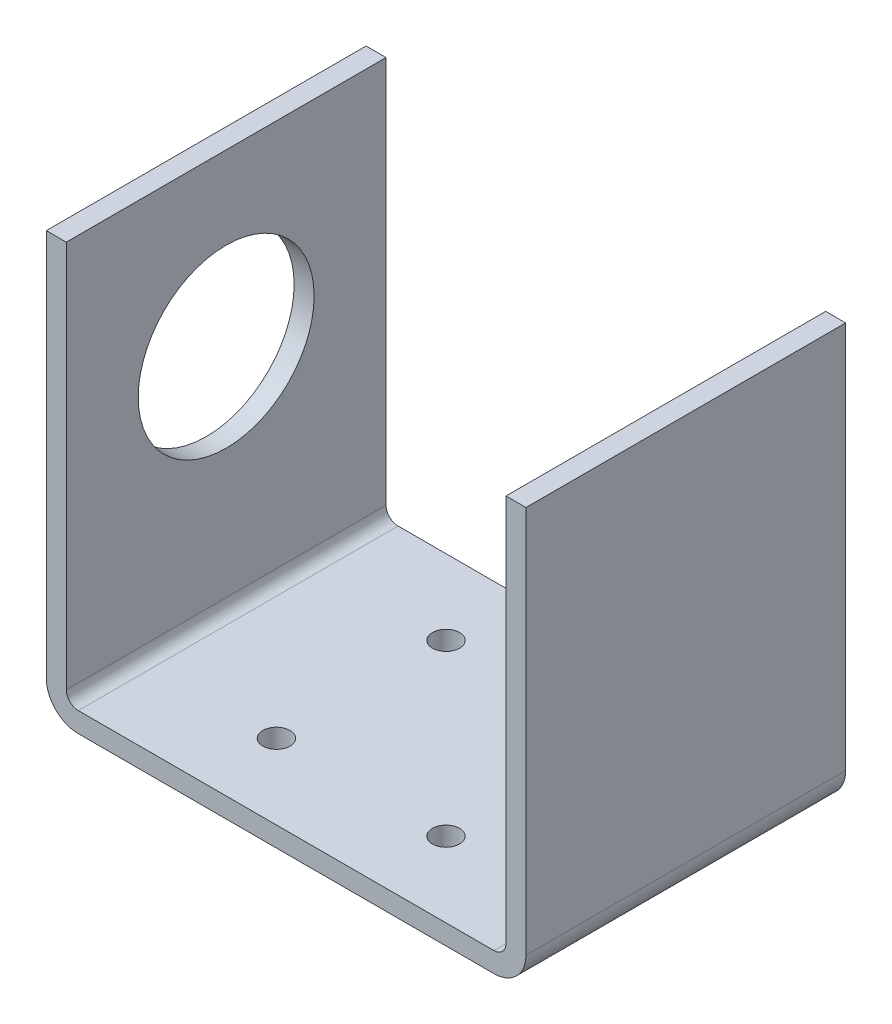
ISO-10303-21;
HEADER;
FILE_DESCRIPTION(('STEP AP214'),'2;1');
FILE_NAME('part.step','',(''),(''),'','','');
FILE_SCHEMA(('AUTOMOTIVE_DESIGN { 1 0 10303 214 1 1 1 1 }'));
ENDSEC;
DATA;
#1=APPLICATION_CONTEXT('core data for automotive mechanical design processes');
#2=APPLICATION_PROTOCOL_DEFINITION('international standard','automotive_design',2000,#1);
#3=PRODUCT_CONTEXT('',#1,'mechanical');
#4=PRODUCT('Part','Part','',(#3));
#5=PRODUCT_RELATED_PRODUCT_CATEGORY('part','',(#4));
#6=PRODUCT_DEFINITION_FORMATION('','',#4);
#7=PRODUCT_DEFINITION_CONTEXT('part definition',#1,'design');
#8=PRODUCT_DEFINITION('design','',#6,#7);
#9=PRODUCT_DEFINITION_SHAPE('','',#8);
#10=(LENGTH_UNIT() NAMED_UNIT(*) SI_UNIT(.MILLI.,.METRE.));
#11=(NAMED_UNIT(*) PLANE_ANGLE_UNIT() SI_UNIT($,.RADIAN.));
#12=(NAMED_UNIT(*) SI_UNIT($,.STERADIAN.) SOLID_ANGLE_UNIT());
#13=UNCERTAINTY_MEASURE_WITH_UNIT(LENGTH_MEASURE(1.E-05),#10,'distance_accuracy_value','');
#14=(GEOMETRIC_REPRESENTATION_CONTEXT(3) GLOBAL_UNCERTAINTY_ASSIGNED_CONTEXT((#13)) GLOBAL_UNIT_ASSIGNED_CONTEXT((#10,
#11,#12)) REPRESENTATION_CONTEXT('',''));
#15=CARTESIAN_POINT('',(0.,0.,0.));
#16=DIRECTION('',(0.,0.,1.));
#17=DIRECTION('',(1.,0.,0.));
#18=AXIS2_PLACEMENT_3D('',#15,#16,#17);
#19=CARTESIAN_POINT('',(30.,2.5,20.));
#20=DIRECTION('',(-1.,0.,0.));
#21=DIRECTION('',(0.,0.,1.));
#22=AXIS2_PLACEMENT_3D('',#19,#20,#21);
#23=PLANE('',#22);
#24=DIRECTION('',(0.,-1.,0.));
#25=VECTOR('',#24,1.);
#26=CARTESIAN_POINT('',(30.,2.5,20.));
#27=LINE('',#26,#25);
#28=CARTESIAN_POINT('',(30.,52.5,20.));
#29=VERTEX_POINT('',#28);
#30=CARTESIAN_POINT('',(30.,4.,20.));
#31=VERTEX_POINT('',#30);
#32=EDGE_CURVE('E142',#29,#31,#27,.T.);
#33=ORIENTED_EDGE('',*,*,#32,.T.);
#34=DIRECTION('',(0.,0.,-1.));
#35=VECTOR('',#34,1.);
#36=CARTESIAN_POINT('',(30.,4.,-20.));
#37=LINE('',#36,#35);
#38=CARTESIAN_POINT('',(30.,4.,-20.));
#39=VERTEX_POINT('',#38);
#40=EDGE_CURVE('E215',#31,#39,#37,.T.);
#41=ORIENTED_EDGE('',*,*,#40,.T.);
#42=DIRECTION('',(0.,-1.,0.));
#43=VECTOR('',#42,1.);
#44=CARTESIAN_POINT('',(30.,2.5,-20.));
#45=LINE('',#44,#43);
#46=CARTESIAN_POINT('',(30.,52.5,-20.));
#47=VERTEX_POINT('',#46);
#48=EDGE_CURVE('E212',#47,#39,#45,.T.);
#49=ORIENTED_EDGE('',*,*,#48,.F.);
#50=DIRECTION('',(0.,0.,1.));
#51=VECTOR('',#50,1.);
#52=CARTESIAN_POINT('',(30.,52.5,-70.062460986252));
#53=LINE('',#52,#51);
#54=EDGE_CURVE('E131',#47,#29,#53,.T.);
#55=ORIENTED_EDGE('',*,*,#54,.T.);
#56=EDGE_LOOP('',(#33,#41,#49,#55));
#57=FACE_BOUND('',#56,.T.);
#58=ADVANCED_FACE('F33',(#57),#23,.F.);
#59=CARTESIAN_POINT('',(-30.,2.5,-20.));
#60=DIRECTION('',(0.,0.,1.));
#61=DIRECTION('',(1.,0.,0.));
#62=AXIS2_PLACEMENT_3D('',#59,#60,#61);
#63=PLANE('',#62);
#64=ORIENTED_EDGE('',*,*,#48,.T.);
#65=CARTESIAN_POINT('',(26.,4.,-20.));
#66=DIRECTION('',(0.,0.,1.));
#67=DIRECTION('',(1.,0.,0.));
#68=AXIS2_PLACEMENT_3D('',#65,#66,#67);
#69=CIRCLE('',#68,4.);
#70=CARTESIAN_POINT('',(26.,0.,-20.));
#71=VERTEX_POINT('',#70);
#72=EDGE_CURVE('E220',#39,#71,#69,.F.);
#73=ORIENTED_EDGE('',*,*,#72,.T.);
#74=DIRECTION('',(-1.,0.,0.));
#75=VECTOR('',#74,1.);
#76=CARTESIAN_POINT('',(-30.,0.,-20.));
#77=LINE('',#76,#75);
#78=CARTESIAN_POINT('',(-26.,0.,-20.));
#79=VERTEX_POINT('',#78);
#80=EDGE_CURVE('E194',#71,#79,#77,.T.);
#81=ORIENTED_EDGE('',*,*,#80,.T.);
#82=CARTESIAN_POINT('',(-26.,4.,-20.));
#83=DIRECTION('',(0.,0.,1.));
#84=DIRECTION('',(1.,0.,0.));
#85=AXIS2_PLACEMENT_3D('',#82,#83,#84);
#86=CIRCLE('',#85,4.);
#87=CARTESIAN_POINT('',(-30.,4.,-20.));
#88=VERTEX_POINT('',#87);
#89=EDGE_CURVE('E218',#79,#88,#86,.F.);
#90=ORIENTED_EDGE('',*,*,#89,.T.);
#91=DIRECTION('',(0.,-1.,0.));
#92=VECTOR('',#91,1.);
#93=CARTESIAN_POINT('',(-30.,2.5,-20.));
#94=LINE('',#93,#92);
#95=CARTESIAN_POINT('',(-30.,52.5,-20.));
#96=VERTEX_POINT('',#95);
#97=EDGE_CURVE('E209',#96,#88,#94,.T.);
#98=ORIENTED_EDGE('',*,*,#97,.F.);
#99=DIRECTION('',(1.,0.,0.));
#100=VECTOR('',#99,1.);
#101=CARTESIAN_POINT('',(-30.,52.5,-20.));
#102=LINE('',#101,#100);
#103=CARTESIAN_POINT('',(-27.5,52.5,-20.));
#104=VERTEX_POINT('',#103);
#105=EDGE_CURVE('E155',#96,#104,#102,.T.);
#106=ORIENTED_EDGE('',*,*,#105,.T.);
#107=DIRECTION('',(0.,-1.,0.));
#108=VECTOR('',#107,1.);
#109=CARTESIAN_POINT('',(-27.5,52.5,-20.));
#110=LINE('',#109,#108);
#111=CARTESIAN_POINT('',(-27.5,4.,-20.));
#112=VERTEX_POINT('',#111);
#113=EDGE_CURVE('E157',#104,#112,#110,.T.);
#114=ORIENTED_EDGE('',*,*,#113,.T.);
#115=CARTESIAN_POINT('',(-26.,4.,-20.));
#116=DIRECTION('',(0.,0.,1.));
#117=DIRECTION('',(1.,0.,0.));
#118=AXIS2_PLACEMENT_3D('',#115,#116,#117);
#119=CIRCLE('',#118,1.5);
#120=CARTESIAN_POINT('',(-26.,2.5,-20.));
#121=VERTEX_POINT('',#120);
#122=EDGE_CURVE('E243',#112,#121,#119,.T.);
#123=ORIENTED_EDGE('',*,*,#122,.T.);
#124=DIRECTION('',(-1.,0.,0.));
#125=VECTOR('',#124,1.);
#126=CARTESIAN_POINT('',(-30.,2.5,-20.));
#127=LINE('',#126,#125);
#128=CARTESIAN_POINT('',(26.,2.5,-20.));
#129=VERTEX_POINT('',#128);
#130=EDGE_CURVE('E195',#129,#121,#127,.T.);
#131=ORIENTED_EDGE('',*,*,#130,.F.);
#132=CARTESIAN_POINT('',(26.,4.,-20.));
#133=DIRECTION('',(0.,0.,1.));
#134=DIRECTION('',(1.,0.,0.));
#135=AXIS2_PLACEMENT_3D('',#132,#133,#134);
#136=CIRCLE('',#135,1.5);
#137=CARTESIAN_POINT('',(27.5,4.,-20.));
#138=VERTEX_POINT('',#137);
#139=EDGE_CURVE('E11',#129,#138,#136,.T.);
#140=ORIENTED_EDGE('',*,*,#139,.T.);
#141=DIRECTION('',(0.,1.,0.));
#142=VECTOR('',#141,1.);
#143=CARTESIAN_POINT('',(27.5,52.5,-20.));
#144=LINE('',#143,#142);
#145=CARTESIAN_POINT('',(27.5,52.5,-20.));
#146=VERTEX_POINT('',#145);
#147=EDGE_CURVE('E152',#138,#146,#144,.T.);
#148=ORIENTED_EDGE('',*,*,#147,.T.);
#149=DIRECTION('',(1.,0.,0.));
#150=VECTOR('',#149,1.);
#151=CARTESIAN_POINT('',(30.,52.5,-20.));
#152=LINE('',#151,#150);
#153=EDGE_CURVE('E129',#146,#47,#152,.T.);
#154=ORIENTED_EDGE('',*,*,#153,.T.);
#155=EDGE_LOOP('',(#64,#73,#81,#90,#98,#106,#114,#123,#131,#140,#148,#154));
#156=FACE_BOUND('',#155,.T.);
#157=ADVANCED_FACE('F260',(#156),#63,.F.);
#158=CARTESIAN_POINT('',(-30.,2.5,20.));
#159=DIRECTION('',(1.,0.,0.));
#160=DIRECTION('',(0.,0.,-1.));
#161=AXIS2_PLACEMENT_3D('',#158,#159,#160);
#162=PLANE('',#161);
#163=CARTESIAN_POINT('',(-30.,31.1749307498079,0.));
#164=DIRECTION('',(1.,0.,0.));
#165=DIRECTION('',(0.,0.,-1.));
#166=AXIS2_PLACEMENT_3D('',#163,#164,#165);
#167=CIRCLE('',#166,11.);
#168=CARTESIAN_POINT('',(-30.,31.1749307498079,-11.));
#169=VERTEX_POINT('',#168);
#170=EDGE_CURVE('E144',#169,#169,#167,.F.);
#171=ORIENTED_EDGE('',*,*,#170,.F.);
#172=EDGE_LOOP('',(#171));
#173=FACE_BOUND('',#172,.T.);
#174=ORIENTED_EDGE('',*,*,#97,.T.);
#175=DIRECTION('',(0.,0.,1.));
#176=VECTOR('',#175,1.);
#177=CARTESIAN_POINT('',(-30.,4.,20.));
#178=LINE('',#177,#176);
#179=CARTESIAN_POINT('',(-30.,4.,20.));
#180=VERTEX_POINT('',#179);
#181=EDGE_CURVE('E230',#88,#180,#178,.T.);
#182=ORIENTED_EDGE('',*,*,#181,.T.);
#183=DIRECTION('',(0.,-1.,0.));
#184=VECTOR('',#183,1.);
#185=CARTESIAN_POINT('',(-30.,2.5,20.));
#186=LINE('',#185,#184);
#187=CARTESIAN_POINT('',(-30.,52.5,20.));
#188=VERTEX_POINT('',#187);
#189=EDGE_CURVE('E206',#188,#180,#186,.T.);
#190=ORIENTED_EDGE('',*,*,#189,.F.);
#191=DIRECTION('',(0.,0.,1.));
#192=VECTOR('',#191,1.);
#193=CARTESIAN_POINT('',(-30.,52.5,-70.062460986252));
#194=LINE('',#193,#192);
#195=EDGE_CURVE('E158',#96,#188,#194,.T.);
#196=ORIENTED_EDGE('',*,*,#195,.F.);
#197=EDGE_LOOP('',(#174,#182,#190,#196));
#198=FACE_BOUND('',#197,.T.);
#199=ADVANCED_FACE('F266',(#173,#198),#162,.F.);
#200=CARTESIAN_POINT('',(-30.,2.5,20.));
#201=DIRECTION('',(0.,0.,-1.));
#202=DIRECTION('',(-1.,0.,0.));
#203=AXIS2_PLACEMENT_3D('',#200,#201,#202);
#204=PLANE('',#203);
#205=DIRECTION('',(1.,0.,0.));
#206=VECTOR('',#205,1.);
#207=CARTESIAN_POINT('',(-30.,0.,20.));
#208=LINE('',#207,#206);
#209=CARTESIAN_POINT('',(-26.,0.,20.));
#210=VERTEX_POINT('',#209);
#211=CARTESIAN_POINT('',(26.,0.,20.));
#212=VERTEX_POINT('',#211);
#213=EDGE_CURVE('E199',#210,#212,#208,.T.);
#214=ORIENTED_EDGE('',*,*,#213,.T.);
#215=CARTESIAN_POINT('',(26.,4.,20.));
#216=DIRECTION('',(0.,0.,-1.));
#217=DIRECTION('',(-1.,0.,0.));
#218=AXIS2_PLACEMENT_3D('',#215,#216,#217);
#219=CIRCLE('',#218,4.);
#220=EDGE_CURVE('E228',#212,#31,#219,.F.);
#221=ORIENTED_EDGE('',*,*,#220,.T.);
#222=ORIENTED_EDGE('',*,*,#32,.F.);
#223=DIRECTION('',(-1.,0.,0.));
#224=VECTOR('',#223,1.);
#225=CARTESIAN_POINT('',(30.,52.5,20.));
#226=LINE('',#225,#224);
#227=CARTESIAN_POINT('',(27.5,52.5,20.));
#228=VERTEX_POINT('',#227);
#229=EDGE_CURVE('E127',#29,#228,#226,.T.);
#230=ORIENTED_EDGE('',*,*,#229,.T.);
#231=DIRECTION('',(0.,-1.,0.));
#232=VECTOR('',#231,1.);
#233=CARTESIAN_POINT('',(27.5,52.5,20.));
#234=LINE('',#233,#232);
#235=CARTESIAN_POINT('',(27.5,4.,20.));
#236=VERTEX_POINT('',#235);
#237=EDGE_CURVE('E132',#228,#236,#234,.T.);
#238=ORIENTED_EDGE('',*,*,#237,.T.);
#239=CARTESIAN_POINT('',(26.,4.,20.));
#240=DIRECTION('',(0.,0.,-1.));
#241=DIRECTION('',(-1.,0.,0.));
#242=AXIS2_PLACEMENT_3D('',#239,#240,#241);
#243=CIRCLE('',#242,1.5);
#244=CARTESIAN_POINT('',(26.,2.5,20.));
#245=VERTEX_POINT('',#244);
#246=EDGE_CURVE('E41',#236,#245,#243,.T.);
#247=ORIENTED_EDGE('',*,*,#246,.T.);
#248=DIRECTION('',(1.,0.,0.));
#249=VECTOR('',#248,1.);
#250=CARTESIAN_POINT('',(-30.,2.5,20.));
#251=LINE('',#250,#249);
#252=CARTESIAN_POINT('',(-26.,2.5,20.));
#253=VERTEX_POINT('',#252);
#254=EDGE_CURVE('E198',#253,#245,#251,.T.);
#255=ORIENTED_EDGE('',*,*,#254,.F.);
#256=CARTESIAN_POINT('',(-26.,4.,20.));
#257=DIRECTION('',(0.,0.,-1.));
#258=DIRECTION('',(-1.,0.,0.));
#259=AXIS2_PLACEMENT_3D('',#256,#257,#258);
#260=CIRCLE('',#259,1.5);
#261=CARTESIAN_POINT('',(-27.5,4.,20.));
#262=VERTEX_POINT('',#261);
#263=EDGE_CURVE('E241',#253,#262,#260,.T.);
#264=ORIENTED_EDGE('',*,*,#263,.T.);
#265=DIRECTION('',(0.,1.,0.));
#266=VECTOR('',#265,1.);
#267=CARTESIAN_POINT('',(-27.5,52.5,20.));
#268=LINE('',#267,#266);
#269=CARTESIAN_POINT('',(-27.5,52.5,20.));
#270=VERTEX_POINT('',#269);
#271=EDGE_CURVE('E154',#262,#270,#268,.T.);
#272=ORIENTED_EDGE('',*,*,#271,.T.);
#273=DIRECTION('',(-1.,0.,0.));
#274=VECTOR('',#273,1.);
#275=CARTESIAN_POINT('',(-30.,52.5,20.));
#276=LINE('',#275,#274);
#277=EDGE_CURVE('E160',#270,#188,#276,.T.);
#278=ORIENTED_EDGE('',*,*,#277,.T.);
#279=ORIENTED_EDGE('',*,*,#189,.T.);
#280=CARTESIAN_POINT('',(-26.,4.,20.));
#281=DIRECTION('',(0.,0.,-1.));
#282=DIRECTION('',(-1.,0.,0.));
#283=AXIS2_PLACEMENT_3D('',#280,#281,#282);
#284=CIRCLE('',#283,4.);
#285=EDGE_CURVE('E226',#180,#210,#284,.F.);
#286=ORIENTED_EDGE('',*,*,#285,.T.);
#287=EDGE_LOOP('',(#214,#221,#222,#230,#238,#247,#255,#264,#272,#278,#279,#286));
#288=FACE_BOUND('',#287,.T.);
#289=ADVANCED_FACE('F140',(#288),#204,.F.);
#290=CARTESIAN_POINT('',(0.,2.5,0.));
#291=DIRECTION('',(0.,-1.,0.));
#292=DIRECTION('',(0.,0.,-1.));
#293=AXIS2_PLACEMENT_3D('',#290,#291,#292);
#294=PLANE('',#293);
#295=CARTESIAN_POINT('',(10.6066017177982,2.5,-10.6066017177982));
#296=DIRECTION('',(0.,1.,0.));
#297=DIRECTION('',(0.,0.,1.));
#298=AXIS2_PLACEMENT_3D('',#295,#296,#297);
#299=CIRCLE('',#298,1.7);
#300=CARTESIAN_POINT('',(10.6066017177982,2.5,-8.90660171779823));
#301=VERTEX_POINT('',#300);
#302=EDGE_CURVE('E170',#301,#301,#299,.T.);
#303=ORIENTED_EDGE('',*,*,#302,.F.);
#304=EDGE_LOOP('',(#303));
#305=FACE_BOUND('',#304,.T.);
#306=CARTESIAN_POINT('',(10.6066017177988,2.5,10.6066017177982));
#307=DIRECTION('',(0.,1.,0.));
#308=DIRECTION('',(0.,0.,1.));
#309=AXIS2_PLACEMENT_3D('',#306,#307,#308);
#310=CIRCLE('',#309,1.7);
#311=CARTESIAN_POINT('',(10.6066017177988,2.5,12.3066017177982));
#312=VERTEX_POINT('',#311);
#313=EDGE_CURVE('E176',#312,#312,#310,.T.);
#314=ORIENTED_EDGE('',*,*,#313,.F.);
#315=EDGE_LOOP('',(#314));
#316=FACE_BOUND('',#315,.T.);
#317=CARTESIAN_POINT('',(-10.6066017177976,2.5,10.6066017177988));
#318=DIRECTION('',(0.,1.,0.));
#319=DIRECTION('',(0.,0.,1.));
#320=AXIS2_PLACEMENT_3D('',#317,#318,#319);
#321=CIRCLE('',#320,1.7);
#322=CARTESIAN_POINT('',(-10.6066017177976,2.5,12.3066017177988));
#323=VERTEX_POINT('',#322);
#324=EDGE_CURVE('E182',#323,#323,#321,.T.);
#325=ORIENTED_EDGE('',*,*,#324,.F.);
#326=EDGE_LOOP('',(#325));
#327=FACE_BOUND('',#326,.T.);
#328=CARTESIAN_POINT('',(-10.6066017177982,2.5,-10.6066017177976));
#329=DIRECTION('',(0.,1.,0.));
#330=DIRECTION('',(0.,0.,1.));
#331=AXIS2_PLACEMENT_3D('',#328,#329,#330);
#332=CIRCLE('',#331,1.7);
#333=CARTESIAN_POINT('',(-10.6066017177982,2.5,-8.90660171779759));
#334=VERTEX_POINT('',#333);
#335=EDGE_CURVE('E188',#334,#334,#332,.T.);
#336=ORIENTED_EDGE('',*,*,#335,.F.);
#337=EDGE_LOOP('',(#336));
#338=FACE_BOUND('',#337,.T.);
#339=ORIENTED_EDGE('',*,*,#130,.T.);
#340=DIRECTION('',(0.,0.,1.));
#341=VECTOR('',#340,1.);
#342=CARTESIAN_POINT('',(-26.,2.5,0.));
#343=LINE('',#342,#341);
#344=EDGE_CURVE('E235',#121,#253,#343,.T.);
#345=ORIENTED_EDGE('',*,*,#344,.T.);
#346=ORIENTED_EDGE('',*,*,#254,.T.);
#347=DIRECTION('',(0.,0.,1.));
#348=VECTOR('',#347,1.);
#349=CARTESIAN_POINT('',(26.,2.5,0.));
#350=LINE('',#349,#348);
#351=EDGE_CURVE('E233',#245,#129,#350,.F.);
#352=ORIENTED_EDGE('',*,*,#351,.T.);
#353=EDGE_LOOP('',(#339,#345,#346,#352));
#354=FACE_BOUND('',#353,.T.);
#355=ADVANCED_FACE('F246',(#305,#316,#327,#338,#354),#294,.F.);
#356=CARTESIAN_POINT('',(0.,0.,0.));
#357=DIRECTION('',(0.,-1.,0.));
#358=DIRECTION('',(0.,0.,-1.));
#359=AXIS2_PLACEMENT_3D('',#356,#357,#358);
#360=PLANE('',#359);
#361=CARTESIAN_POINT('',(10.6066017177982,0.,-10.6066017177982));
#362=DIRECTION('',(0.,1.,0.));
#363=DIRECTION('',(0.,0.,1.));
#364=AXIS2_PLACEMENT_3D('',#361,#362,#363);
#365=CIRCLE('',#364,1.7);
#366=CARTESIAN_POINT('',(10.6066017177982,0.,-8.90660171779823));
#367=VERTEX_POINT('',#366);
#368=EDGE_CURVE('E173',#367,#367,#365,.T.);
#369=ORIENTED_EDGE('',*,*,#368,.T.);
#370=EDGE_LOOP('',(#369));
#371=FACE_BOUND('',#370,.T.);
#372=CARTESIAN_POINT('',(10.6066017177988,0.,10.6066017177982));
#373=DIRECTION('',(0.,1.,0.));
#374=DIRECTION('',(0.,0.,1.));
#375=AXIS2_PLACEMENT_3D('',#372,#373,#374);
#376=CIRCLE('',#375,1.7);
#377=CARTESIAN_POINT('',(10.6066017177988,0.,12.3066017177982));
#378=VERTEX_POINT('',#377);
#379=EDGE_CURVE('E179',#378,#378,#376,.T.);
#380=ORIENTED_EDGE('',*,*,#379,.T.);
#381=EDGE_LOOP('',(#380));
#382=FACE_BOUND('',#381,.T.);
#383=CARTESIAN_POINT('',(-10.6066017177976,0.,10.6066017177988));
#384=DIRECTION('',(0.,1.,0.));
#385=DIRECTION('',(0.,0.,1.));
#386=AXIS2_PLACEMENT_3D('',#383,#384,#385);
#387=CIRCLE('',#386,1.7);
#388=CARTESIAN_POINT('',(-10.6066017177976,0.,12.3066017177988));
#389=VERTEX_POINT('',#388);
#390=EDGE_CURVE('E185',#389,#389,#387,.T.);
#391=ORIENTED_EDGE('',*,*,#390,.T.);
#392=EDGE_LOOP('',(#391));
#393=FACE_BOUND('',#392,.T.);
#394=CARTESIAN_POINT('',(-10.6066017177982,0.,-10.6066017177976));
#395=DIRECTION('',(0.,1.,0.));
#396=DIRECTION('',(0.,0.,1.));
#397=AXIS2_PLACEMENT_3D('',#394,#395,#396);
#398=CIRCLE('',#397,1.7);
#399=CARTESIAN_POINT('',(-10.6066017177982,0.,-8.90660171779759));
#400=VERTEX_POINT('',#399);
#401=EDGE_CURVE('E191',#400,#400,#398,.T.);
#402=ORIENTED_EDGE('',*,*,#401,.T.);
#403=EDGE_LOOP('',(#402));
#404=FACE_BOUND('',#403,.T.);
#405=ORIENTED_EDGE('',*,*,#80,.F.);
#406=DIRECTION('',(0.,0.,-1.));
#407=VECTOR('',#406,1.);
#408=CARTESIAN_POINT('',(26.,0.,20.));
#409=LINE('',#408,#407);
#410=EDGE_CURVE('E224',#71,#212,#409,.F.);
#411=ORIENTED_EDGE('',*,*,#410,.T.);
#412=ORIENTED_EDGE('',*,*,#213,.F.);
#413=DIRECTION('',(0.,0.,1.));
#414=VECTOR('',#413,1.);
#415=CARTESIAN_POINT('',(-26.,0.,-20.));
#416=LINE('',#415,#414);
#417=EDGE_CURVE('E222',#210,#79,#416,.F.);
#418=ORIENTED_EDGE('',*,*,#417,.T.);
#419=EDGE_LOOP('',(#405,#411,#412,#418));
#420=FACE_BOUND('',#419,.T.);
#421=ADVANCED_FACE('F323',(#371,#382,#393,#404,#420),#360,.T.);
#422=CARTESIAN_POINT('',(-10.6066017177982,2.5,-10.6066017177976));
#423=DIRECTION('',(0.,1.,0.));
#424=DIRECTION('',(0.,0.,1.));
#425=AXIS2_PLACEMENT_3D('',#422,#423,#424);
#426=CYLINDRICAL_SURFACE('',#425,1.7);
#427=ORIENTED_EDGE('',*,*,#401,.F.);
#428=EDGE_LOOP('',(#427));
#429=FACE_BOUND('',#428,.T.);
#430=ORIENTED_EDGE('',*,*,#335,.T.);
#431=EDGE_LOOP('',(#430));
#432=FACE_BOUND('',#431,.T.);
#433=ADVANCED_FACE('F319',(#429,#432),#426,.F.);
#434=CARTESIAN_POINT('',(-10.6066017177976,2.5,10.6066017177988));
#435=DIRECTION('',(0.,1.,0.));
#436=DIRECTION('',(0.,0.,1.));
#437=AXIS2_PLACEMENT_3D('',#434,#435,#436);
#438=CYLINDRICAL_SURFACE('',#437,1.7);
#439=ORIENTED_EDGE('',*,*,#390,.F.);
#440=EDGE_LOOP('',(#439));
#441=FACE_BOUND('',#440,.T.);
#442=ORIENTED_EDGE('',*,*,#324,.T.);
#443=EDGE_LOOP('',(#442));
#444=FACE_BOUND('',#443,.T.);
#445=ADVANCED_FACE('F315',(#441,#444),#438,.F.);
#446=CARTESIAN_POINT('',(10.6066017177988,2.5,10.6066017177982));
#447=DIRECTION('',(0.,1.,0.));
#448=DIRECTION('',(0.,0.,1.));
#449=AXIS2_PLACEMENT_3D('',#446,#447,#448);
#450=CYLINDRICAL_SURFACE('',#449,1.7);
#451=ORIENTED_EDGE('',*,*,#379,.F.);
#452=EDGE_LOOP('',(#451));
#453=FACE_BOUND('',#452,.T.);
#454=ORIENTED_EDGE('',*,*,#313,.T.);
#455=EDGE_LOOP('',(#454));
#456=FACE_BOUND('',#455,.T.);
#457=ADVANCED_FACE('F311',(#453,#456),#450,.F.);
#458=CARTESIAN_POINT('',(10.6066017177982,2.5,-10.6066017177982));
#459=DIRECTION('',(0.,1.,0.));
#460=DIRECTION('',(0.,0.,1.));
#461=AXIS2_PLACEMENT_3D('',#458,#459,#460);
#462=CYLINDRICAL_SURFACE('',#461,1.7);
#463=ORIENTED_EDGE('',*,*,#368,.F.);
#464=EDGE_LOOP('',(#463));
#465=FACE_BOUND('',#464,.T.);
#466=ORIENTED_EDGE('',*,*,#302,.T.);
#467=EDGE_LOOP('',(#466));
#468=FACE_BOUND('',#467,.T.);
#469=ADVANCED_FACE('F305',(#465,#468),#462,.F.);
#470=CARTESIAN_POINT('',(-30.,52.5,-70.062460986252));
#471=DIRECTION('',(0.,1.,0.));
#472=DIRECTION('',(0.,0.,1.));
#473=AXIS2_PLACEMENT_3D('',#470,#471,#472);
#474=PLANE('',#473);
#475=ORIENTED_EDGE('',*,*,#105,.F.);
#476=ORIENTED_EDGE('',*,*,#195,.T.);
#477=ORIENTED_EDGE('',*,*,#277,.F.);
#478=DIRECTION('',(0.,0.,1.));
#479=VECTOR('',#478,1.);
#480=CARTESIAN_POINT('',(-27.5,52.5,-70.062460986252));
#481=LINE('',#480,#479);
#482=EDGE_CURVE('E163',#104,#270,#481,.T.);
#483=ORIENTED_EDGE('',*,*,#482,.F.);
#484=EDGE_LOOP('',(#475,#476,#477,#483));
#485=FACE_BOUND('',#484,.T.);
#486=ADVANCED_FACE('F287',(#485),#474,.T.);
#487=CARTESIAN_POINT('',(-27.5,52.5,-70.062460986252));
#488=DIRECTION('',(1.,0.,0.));
#489=DIRECTION('',(0.,1.,0.));
#490=AXIS2_PLACEMENT_3D('',#487,#488,#489);
#491=PLANE('',#490);
#492=CARTESIAN_POINT('',(-27.5,31.1749307498079,0.));
#493=DIRECTION('',(1.,0.,0.));
#494=DIRECTION('',(0.,1.,0.));
#495=AXIS2_PLACEMENT_3D('',#492,#493,#494);
#496=CIRCLE('',#495,11.);
#497=CARTESIAN_POINT('',(-27.5,31.1749307498079,-11.));
#498=VERTEX_POINT('',#497);
#499=EDGE_CURVE('E147',#498,#498,#496,.F.);
#500=ORIENTED_EDGE('',*,*,#499,.T.);
#501=EDGE_LOOP('',(#500));
#502=FACE_BOUND('',#501,.T.);
#503=ORIENTED_EDGE('',*,*,#271,.F.);
#504=DIRECTION('',(0.,0.,1.));
#505=VECTOR('',#504,1.);
#506=CARTESIAN_POINT('',(-27.5,4.,-70.062460986252));
#507=LINE('',#506,#505);
#508=EDGE_CURVE('E238',#262,#112,#507,.F.);
#509=ORIENTED_EDGE('',*,*,#508,.T.);
#510=ORIENTED_EDGE('',*,*,#113,.F.);
#511=ORIENTED_EDGE('',*,*,#482,.T.);
#512=EDGE_LOOP('',(#503,#509,#510,#511));
#513=FACE_BOUND('',#512,.T.);
#514=ADVANCED_FACE('F293',(#502,#513),#491,.T.);
#515=CARTESIAN_POINT('',(30.,52.5,-70.062460986252));
#516=DIRECTION('',(0.,1.,0.));
#517=DIRECTION('',(0.,0.,1.));
#518=AXIS2_PLACEMENT_3D('',#515,#516,#517);
#519=PLANE('',#518);
#520=ORIENTED_EDGE('',*,*,#153,.F.);
#521=DIRECTION('',(0.,0.,1.));
#522=VECTOR('',#521,1.);
#523=CARTESIAN_POINT('',(27.5,52.5,-70.062460986252));
#524=LINE('',#523,#522);
#525=EDGE_CURVE('E122',#146,#228,#524,.T.);
#526=ORIENTED_EDGE('',*,*,#525,.T.);
#527=ORIENTED_EDGE('',*,*,#229,.F.);
#528=ORIENTED_EDGE('',*,*,#54,.F.);
#529=EDGE_LOOP('',(#520,#526,#527,#528));
#530=FACE_BOUND('',#529,.T.);
#531=ADVANCED_FACE('F124',(#530),#519,.T.);
#532=CARTESIAN_POINT('',(27.5,52.5,-70.062460986252));
#533=DIRECTION('',(-1.,0.,0.));
#534=DIRECTION('',(0.,-1.,0.));
#535=AXIS2_PLACEMENT_3D('',#532,#533,#534);
#536=PLANE('',#535);
#537=ORIENTED_EDGE('',*,*,#147,.F.);
#538=DIRECTION('',(0.,0.,1.));
#539=VECTOR('',#538,1.);
#540=CARTESIAN_POINT('',(27.5,4.,-70.062460986252));
#541=LINE('',#540,#539);
#542=EDGE_CURVE('E136',#138,#236,#541,.T.);
#543=ORIENTED_EDGE('',*,*,#542,.T.);
#544=ORIENTED_EDGE('',*,*,#237,.F.);
#545=ORIENTED_EDGE('',*,*,#525,.F.);
#546=EDGE_LOOP('',(#537,#543,#544,#545));
#547=FACE_BOUND('',#546,.T.);
#548=ADVANCED_FACE('F135',(#547),#536,.T.);
#549=CARTESIAN_POINT('',(26.,4.,20.));
#550=DIRECTION('',(0.,0.,1.));
#551=DIRECTION('',(1.,0.,0.));
#552=AXIS2_PLACEMENT_3D('',#549,#550,#551);
#553=CYLINDRICAL_SURFACE('',#552,4.);
#554=ORIENTED_EDGE('',*,*,#220,.F.);
#555=ORIENTED_EDGE('',*,*,#410,.F.);
#556=ORIENTED_EDGE('',*,*,#72,.F.);
#557=ORIENTED_EDGE('',*,*,#40,.F.);
#558=EDGE_LOOP('',(#554,#555,#556,#557));
#559=FACE_BOUND('',#558,.T.);
#560=ADVANCED_FACE('F270',(#559),#553,.T.);
#561=CARTESIAN_POINT('',(-26.,4.,20.));
#562=DIRECTION('',(0.,0.,-1.));
#563=DIRECTION('',(-1.,0.,0.));
#564=AXIS2_PLACEMENT_3D('',#561,#562,#563);
#565=CYLINDRICAL_SURFACE('',#564,4.);
#566=ORIENTED_EDGE('',*,*,#89,.F.);
#567=ORIENTED_EDGE('',*,*,#417,.F.);
#568=ORIENTED_EDGE('',*,*,#285,.F.);
#569=ORIENTED_EDGE('',*,*,#181,.F.);
#570=EDGE_LOOP('',(#566,#567,#568,#569));
#571=FACE_BOUND('',#570,.T.);
#572=ADVANCED_FACE('F257',(#571),#565,.T.);
#573=CARTESIAN_POINT('',(-26.,4.,0.));
#574=DIRECTION('',(0.,0.,1.));
#575=DIRECTION('',(1.,0.,0.));
#576=AXIS2_PLACEMENT_3D('',#573,#574,#575);
#577=CYLINDRICAL_SURFACE('',#576,1.5);
#578=ORIENTED_EDGE('',*,*,#122,.F.);
#579=ORIENTED_EDGE('',*,*,#508,.F.);
#580=ORIENTED_EDGE('',*,*,#263,.F.);
#581=ORIENTED_EDGE('',*,*,#344,.F.);
#582=EDGE_LOOP('',(#578,#579,#580,#581));
#583=FACE_BOUND('',#582,.T.);
#584=ADVANCED_FACE('F250',(#583),#577,.F.);
#585=CARTESIAN_POINT('',(26.,4.,-70.062460986252));
#586=DIRECTION('',(0.,0.,1.));
#587=DIRECTION('',(1.,0.,0.));
#588=AXIS2_PLACEMENT_3D('',#585,#586,#587);
#589=CYLINDRICAL_SURFACE('',#588,1.5);
#590=ORIENTED_EDGE('',*,*,#139,.F.);
#591=ORIENTED_EDGE('',*,*,#351,.F.);
#592=ORIENTED_EDGE('',*,*,#246,.F.);
#593=ORIENTED_EDGE('',*,*,#542,.F.);
#594=EDGE_LOOP('',(#590,#591,#592,#593));
#595=FACE_BOUND('',#594,.T.);
#596=ADVANCED_FACE('F35',(#595),#589,.F.);
#597=CARTESIAN_POINT('',(-30.000012,31.1749307498079,0.));
#598=DIRECTION('',(1.,0.,0.));
#599=DIRECTION('',(0.,0.,-1.));
#600=AXIS2_PLACEMENT_3D('',#597,#598,#599);
#601=CYLINDRICAL_SURFACE('',#600,11.);
#602=CARTESIAN_POINT('',(-27.5,31.1749307498079,-11.));
#603=CARTESIAN_POINT('',(-27.5260416666667,31.1749307498079,-11.));
#604=CARTESIAN_POINT('',(-27.5520833333333,31.1749307498079,-11.));
#605=CARTESIAN_POINT('',(-27.6041666666667,31.1749307498079,-11.));
#606=CARTESIAN_POINT('',(-27.6302083333333,31.1749307498079,-11.));
#607=CARTESIAN_POINT('',(-27.6822916666667,31.1749307498079,-11.));
#608=CARTESIAN_POINT('',(-27.7083333333333,31.1749307498079,-11.));
#609=CARTESIAN_POINT('',(-27.7604166666667,31.1749307498079,-11.));
#610=CARTESIAN_POINT('',(-27.7864583333333,31.1749307498079,-11.));
#611=CARTESIAN_POINT('',(-27.8385416666667,31.1749307498079,-11.));
#612=CARTESIAN_POINT('',(-27.8645833333333,31.1749307498079,-11.));
#613=CARTESIAN_POINT('',(-27.9166666666667,31.1749307498079,-11.));
#614=CARTESIAN_POINT('',(-27.9427083333333,31.1749307498079,-11.));
#615=CARTESIAN_POINT('',(-27.9947916666667,31.1749307498079,-11.));
#616=CARTESIAN_POINT('',(-28.0208333333333,31.1749307498079,-11.));
#617=CARTESIAN_POINT('',(-28.0729166666667,31.1749307498079,-11.));
#618=CARTESIAN_POINT('',(-28.0989583333333,31.1749307498079,-11.));
#619=CARTESIAN_POINT('',(-28.1510416666667,31.1749307498079,-11.));
#620=CARTESIAN_POINT('',(-28.1770833333333,31.1749307498079,-11.));
#621=CARTESIAN_POINT('',(-28.2291666666667,31.1749307498079,-11.));
#622=CARTESIAN_POINT('',(-28.2552083333333,31.1749307498079,-11.));
#623=CARTESIAN_POINT('',(-28.3072916666667,31.1749307498079,-11.));
#624=CARTESIAN_POINT('',(-28.3333333333333,31.1749307498079,-11.));
#625=CARTESIAN_POINT('',(-28.3854166666667,31.1749307498079,-11.));
#626=CARTESIAN_POINT('',(-28.4114583333333,31.1749307498079,-11.));
#627=CARTESIAN_POINT('',(-28.4635416666667,31.1749307498079,-11.));
#628=CARTESIAN_POINT('',(-28.4895833333333,31.1749307498079,-11.));
#629=CARTESIAN_POINT('',(-28.5416666666667,31.1749307498079,-11.));
#630=CARTESIAN_POINT('',(-28.5677083333333,31.1749307498079,-11.));
#631=CARTESIAN_POINT('',(-28.6197916666667,31.1749307498079,-11.));
#632=CARTESIAN_POINT('',(-28.6458333333333,31.1749307498079,-11.));
#633=CARTESIAN_POINT('',(-28.6979166666667,31.1749307498079,-11.));
#634=CARTESIAN_POINT('',(-28.7239583333333,31.1749307498079,-11.));
#635=CARTESIAN_POINT('',(-28.7760416666667,31.1749307498079,-11.));
#636=CARTESIAN_POINT('',(-28.8020833333333,31.1749307498079,-11.));
#637=CARTESIAN_POINT('',(-28.8541666666667,31.1749307498079,-11.));
#638=CARTESIAN_POINT('',(-28.8802083333333,31.1749307498079,-11.));
#639=CARTESIAN_POINT('',(-28.9322916666667,31.1749307498079,-11.));
#640=CARTESIAN_POINT('',(-28.9583333333333,31.1749307498079,-11.));
#641=CARTESIAN_POINT('',(-29.0104166666667,31.1749307498079,-11.));
#642=CARTESIAN_POINT('',(-29.0364583333333,31.1749307498079,-11.));
#643=CARTESIAN_POINT('',(-29.0885416666667,31.1749307498079,-11.));
#644=CARTESIAN_POINT('',(-29.1145833333333,31.1749307498079,-11.));
#645=CARTESIAN_POINT('',(-29.1666666666667,31.1749307498079,-11.));
#646=CARTESIAN_POINT('',(-29.1927083333333,31.1749307498079,-11.));
#647=CARTESIAN_POINT('',(-29.2447916666667,31.1749307498079,-11.));
#648=CARTESIAN_POINT('',(-29.2708333333333,31.1749307498079,-11.));
#649=CARTESIAN_POINT('',(-29.3229166666667,31.1749307498079,-11.));
#650=CARTESIAN_POINT('',(-29.3489583333333,31.1749307498079,-11.));
#651=CARTESIAN_POINT('',(-29.4010416666667,31.1749307498079,-11.));
#652=CARTESIAN_POINT('',(-29.4270833333333,31.1749307498079,-11.));
#653=CARTESIAN_POINT('',(-29.4791666666667,31.1749307498079,-11.));
#654=CARTESIAN_POINT('',(-29.5052083333333,31.1749307498079,-11.));
#655=CARTESIAN_POINT('',(-29.5572916666667,31.1749307498079,-11.));
#656=CARTESIAN_POINT('',(-29.5833333333333,31.1749307498079,-11.));
#657=CARTESIAN_POINT('',(-29.6354166666667,31.1749307498079,-11.));
#658=CARTESIAN_POINT('',(-29.6614583333333,31.1749307498079,-11.));
#659=CARTESIAN_POINT('',(-29.7135416666667,31.1749307498079,-11.));
#660=CARTESIAN_POINT('',(-29.7395833333333,31.1749307498079,-11.));
#661=CARTESIAN_POINT('',(-29.7916666666667,31.1749307498079,-11.));
#662=CARTESIAN_POINT('',(-29.8177083333333,31.1749307498079,-11.));
#663=CARTESIAN_POINT('',(-29.8697916666667,31.1749307498079,-11.));
#664=CARTESIAN_POINT('',(-29.8958333333333,31.1749307498079,-11.));
#665=CARTESIAN_POINT('',(-29.9479166666667,31.1749307498079,-11.));
#666=CARTESIAN_POINT('',(-29.9739583333333,31.1749307498079,-11.));
#667=CARTESIAN_POINT('',(-30.,31.1749307498079,-11.));
#668=B_SPLINE_CURVE_WITH_KNOTS('',3,(#602,#603,#604,#605,#606,#607,#608,#609,#610,#611,#612,
#613,#614,#615,#616,#617,#618,#619,#620,#621,#622,#623,#624,#625,#626,#627,#628,#629,#630,#631,
#632,#633,#634,#635,#636,#637,#638,#639,#640,#641,#642,#643,#644,#645,#646,#647,#648,#649,#650,
#651,#652,#653,#654,#655,#656,#657,#658,#659,#660,#661,#662,#663,#664,#665,#666,#667),
.UNSPECIFIED.,.F.,.F.,(4,2,2,2,2,2,2,2,2,2,2,2,2,2,2,2,2,2,2,2,2,2,2,2,2,2,2,2,2,2,2,2,4),(0.,
0.0781250000000018,0.15625,0.234375000000002,0.3125,0.390625000000002,0.46875,0.546874999999999,
0.625000000000001,0.703124999999999,0.781250000000001,0.859374999999999,0.937500000000001,
1.015625,1.09375,1.171875,1.25,1.328125,1.40625,1.484375,1.5625,1.640625,1.71875,1.796875,1.875,
1.953125,2.03125,2.109375,2.1875,2.265625,2.34375,2.421875,2.5),.UNSPECIFIED.);
#669=EDGE_CURVE('BSEAM249',#498,#169,#668,.T.);
#670=ORIENTED_EDGE('',*,*,#499,.F.);
#671=ORIENTED_EDGE('',*,*,#170,.T.);
#672=ORIENTED_EDGE('',*,*,#669,.T.);
#673=ORIENTED_EDGE('',*,*,#669,.F.);
#674=EDGE_LOOP('',(#670,#672,#671,#673));
#675=FACE_BOUND('',#674,.T.);
#676=ADVANCED_FACE('F249',(#675),#601,.F.);
#677=CLOSED_SHELL('',(#58,#157,#199,#289,#355,#421,#433,#445,#457,#469,#486,#514,#531,#548,#560,
#572,#584,#596,#676));
#678=MANIFOLD_SOLID_BREP('B2',#677);
#679=ADVANCED_BREP_SHAPE_REPRESENTATION('',(#18,#678),#14);
#680=SHAPE_DEFINITION_REPRESENTATION(#9,#679);
ENDSEC;
END-ISO-10303-21;
